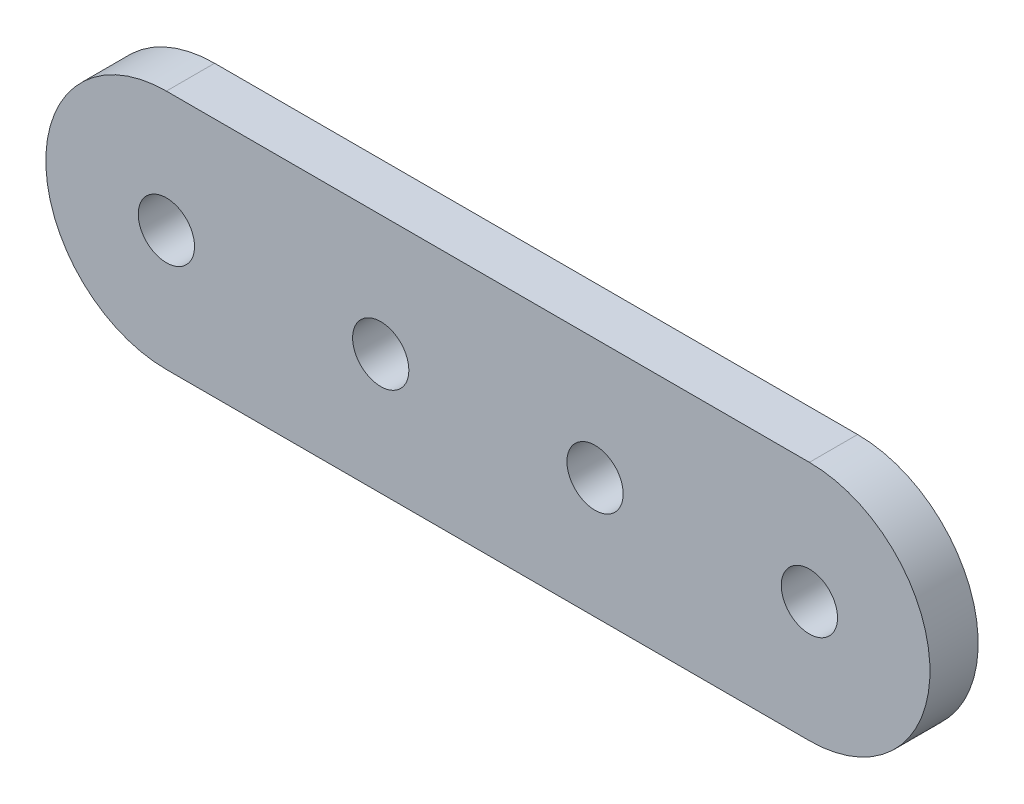
ISO-10303-21;
HEADER;
FILE_DESCRIPTION(('STEP AP214'),'2;1');
FILE_NAME('part.step','',(''),(''),'','','');
FILE_SCHEMA(('AUTOMOTIVE_DESIGN { 1 0 10303 214 1 1 1 1 }'));
ENDSEC;
DATA;
#1=APPLICATION_CONTEXT('core data for automotive mechanical design processes');
#2=APPLICATION_PROTOCOL_DEFINITION('international standard','automotive_design',2000,#1);
#3=PRODUCT_CONTEXT('',#1,'mechanical');
#4=PRODUCT('Part','Part','',(#3));
#5=PRODUCT_RELATED_PRODUCT_CATEGORY('part','',(#4));
#6=PRODUCT_DEFINITION_FORMATION('','',#4);
#7=PRODUCT_DEFINITION_CONTEXT('part definition',#1,'design');
#8=PRODUCT_DEFINITION('design','',#6,#7);
#9=PRODUCT_DEFINITION_SHAPE('','',#8);
#10=(LENGTH_UNIT() NAMED_UNIT(*) SI_UNIT(.MILLI.,.METRE.));
#11=(NAMED_UNIT(*) PLANE_ANGLE_UNIT() SI_UNIT($,.RADIAN.));
#12=(NAMED_UNIT(*) SI_UNIT($,.STERADIAN.) SOLID_ANGLE_UNIT());
#13=UNCERTAINTY_MEASURE_WITH_UNIT(LENGTH_MEASURE(1.E-05),#10,'distance_accuracy_value','');
#14=(GEOMETRIC_REPRESENTATION_CONTEXT(3) GLOBAL_UNCERTAINTY_ASSIGNED_CONTEXT((#13)) GLOBAL_UNIT_ASSIGNED_CONTEXT((#10,
#11,#12)) REPRESENTATION_CONTEXT('',''));
#15=CARTESIAN_POINT('',(0.,0.,0.));
#16=DIRECTION('',(0.,0.,1.));
#17=DIRECTION('',(1.,0.,0.));
#18=AXIS2_PLACEMENT_3D('',#15,#16,#17);
#19=CARTESIAN_POINT('',(20.,0.,3.));
#20=DIRECTION('',(0.,0.,-1.));
#21=DIRECTION('',(-1.,0.,0.));
#22=AXIS2_PLACEMENT_3D('',#19,#20,#21);
#23=PLANE('',#22);
#24=CARTESIAN_POINT('',(-6.66666666666667,0.,3.));
#25=DIRECTION('',(0.,0.,1.));
#26=DIRECTION('',(1.,0.,0.));
#27=AXIS2_PLACEMENT_3D('',#24,#25,#26);
#28=CIRCLE('',#27,1.75);
#29=CARTESIAN_POINT('',(-4.91666666666667,0.,3.));
#30=VERTEX_POINT('',#29);
#31=EDGE_CURVE('E119',#30,#30,#28,.T.);
#32=ORIENTED_EDGE('',*,*,#31,.F.);
#33=EDGE_LOOP('',(#32));
#34=FACE_BOUND('',#33,.T.);
#35=CARTESIAN_POINT('',(-20.,0.,3.));
#36=DIRECTION('',(0.,0.,1.));
#37=DIRECTION('',(1.,0.,0.));
#38=AXIS2_PLACEMENT_3D('',#35,#36,#37);
#39=CIRCLE('',#38,1.75);
#40=CARTESIAN_POINT('',(-18.25,0.,3.));
#41=VERTEX_POINT('',#40);
#42=EDGE_CURVE('E98',#41,#41,#39,.T.);
#43=ORIENTED_EDGE('',*,*,#42,.F.);
#44=EDGE_LOOP('',(#43));
#45=FACE_BOUND('',#44,.T.);
#46=CARTESIAN_POINT('',(20.,0.,3.));
#47=DIRECTION('',(0.,0.,1.));
#48=DIRECTION('',(-1.,0.,0.));
#49=AXIS2_PLACEMENT_3D('',#46,#47,#48);
#50=CIRCLE('',#49,7.5);
#51=CARTESIAN_POINT('',(20.,-7.5,3.));
#52=VERTEX_POINT('',#51);
#53=CARTESIAN_POINT('',(20.,7.5,3.));
#54=VERTEX_POINT('',#53);
#55=EDGE_CURVE('E83',#52,#54,#50,.T.);
#56=ORIENTED_EDGE('',*,*,#55,.T.);
#57=DIRECTION('',(-1.,0.,0.));
#58=VECTOR('',#57,1.);
#59=CARTESIAN_POINT('',(-20.,7.5,3.));
#60=LINE('',#59,#58);
#61=CARTESIAN_POINT('',(-20.,7.5,3.));
#62=VERTEX_POINT('',#61);
#63=EDGE_CURVE('E78',#54,#62,#60,.T.);
#64=ORIENTED_EDGE('',*,*,#63,.T.);
#65=CARTESIAN_POINT('',(-20.,0.,3.));
#66=DIRECTION('',(0.,0.,1.));
#67=DIRECTION('',(1.,0.,0.));
#68=AXIS2_PLACEMENT_3D('',#65,#66,#67);
#69=CIRCLE('',#68,7.5);
#70=CARTESIAN_POINT('',(-20.,-7.5,3.));
#71=VERTEX_POINT('',#70);
#72=EDGE_CURVE('E81',#62,#71,#69,.T.);
#73=ORIENTED_EDGE('',*,*,#72,.T.);
#74=DIRECTION('',(1.,0.,0.));
#75=VECTOR('',#74,1.);
#76=CARTESIAN_POINT('',(-20.,-7.5,3.));
#77=LINE('',#76,#75);
#78=EDGE_CURVE('E48',#71,#52,#77,.T.);
#79=ORIENTED_EDGE('',*,*,#78,.T.);
#80=EDGE_LOOP('',(#56,#64,#73,#79));
#81=FACE_BOUND('',#80,.T.);
#82=CARTESIAN_POINT('',(20.,0.,3.));
#83=DIRECTION('',(0.,0.,1.));
#84=DIRECTION('',(1.,0.,0.));
#85=AXIS2_PLACEMENT_3D('',#82,#83,#84);
#86=CIRCLE('',#85,1.75);
#87=CARTESIAN_POINT('',(21.75,0.,3.));
#88=VERTEX_POINT('',#87);
#89=EDGE_CURVE('E113',#88,#88,#86,.T.);
#90=ORIENTED_EDGE('',*,*,#89,.F.);
#91=EDGE_LOOP('',(#90));
#92=FACE_BOUND('',#91,.T.);
#93=CARTESIAN_POINT('',(6.66666666666667,0.,3.));
#94=DIRECTION('',(0.,0.,1.));
#95=DIRECTION('',(1.,0.,0.));
#96=AXIS2_PLACEMENT_3D('',#93,#94,#95);
#97=CIRCLE('',#96,1.75);
#98=CARTESIAN_POINT('',(8.41666666666667,0.,3.));
#99=VERTEX_POINT('',#98);
#100=EDGE_CURVE('E125',#99,#99,#97,.T.);
#101=ORIENTED_EDGE('',*,*,#100,.F.);
#102=EDGE_LOOP('',(#101));
#103=FACE_BOUND('',#102,.T.);
#104=ADVANCED_FACE('F31',(#34,#45,#81,#92,#103),#23,.F.);
#105=CARTESIAN_POINT('',(20.,0.,0.));
#106=DIRECTION('',(0.,0.,-1.));
#107=DIRECTION('',(-1.,0.,0.));
#108=AXIS2_PLACEMENT_3D('',#105,#106,#107);
#109=PLANE('',#108);
#110=CARTESIAN_POINT('',(-6.66666666666667,0.,0.));
#111=DIRECTION('',(0.,0.,1.));
#112=DIRECTION('',(1.,0.,0.));
#113=AXIS2_PLACEMENT_3D('',#110,#111,#112);
#114=CIRCLE('',#113,1.75);
#115=CARTESIAN_POINT('',(-4.91666666666667,0.,0.));
#116=VERTEX_POINT('',#115);
#117=EDGE_CURVE('E122',#116,#116,#114,.T.);
#118=ORIENTED_EDGE('',*,*,#117,.T.);
#119=EDGE_LOOP('',(#118));
#120=FACE_BOUND('',#119,.T.);
#121=CARTESIAN_POINT('',(-20.,0.,0.));
#122=DIRECTION('',(0.,0.,1.));
#123=DIRECTION('',(1.,0.,0.));
#124=AXIS2_PLACEMENT_3D('',#121,#122,#123);
#125=CIRCLE('',#124,1.75);
#126=CARTESIAN_POINT('',(-18.25,0.,0.));
#127=VERTEX_POINT('',#126);
#128=EDGE_CURVE('E110',#127,#127,#125,.T.);
#129=ORIENTED_EDGE('',*,*,#128,.T.);
#130=EDGE_LOOP('',(#129));
#131=FACE_BOUND('',#130,.T.);
#132=CARTESIAN_POINT('',(20.,0.,0.));
#133=DIRECTION('',(0.,0.,1.));
#134=DIRECTION('',(-1.,0.,0.));
#135=AXIS2_PLACEMENT_3D('',#132,#133,#134);
#136=CIRCLE('',#135,7.5);
#137=CARTESIAN_POINT('',(20.,-7.5,0.));
#138=VERTEX_POINT('',#137);
#139=CARTESIAN_POINT('',(20.,7.5,0.));
#140=VERTEX_POINT('',#139);
#141=EDGE_CURVE('E95',#138,#140,#136,.T.);
#142=ORIENTED_EDGE('',*,*,#141,.F.);
#143=DIRECTION('',(1.,0.,0.));
#144=VECTOR('',#143,1.);
#145=CARTESIAN_POINT('',(-20.,-7.5,0.));
#146=LINE('',#145,#144);
#147=CARTESIAN_POINT('',(-20.,-7.5,0.));
#148=VERTEX_POINT('',#147);
#149=EDGE_CURVE('E71',#148,#138,#146,.T.);
#150=ORIENTED_EDGE('',*,*,#149,.F.);
#151=CARTESIAN_POINT('',(-20.,0.,0.));
#152=DIRECTION('',(0.,0.,1.));
#153=DIRECTION('',(1.,0.,0.));
#154=AXIS2_PLACEMENT_3D('',#151,#152,#153);
#155=CIRCLE('',#154,7.5);
#156=CARTESIAN_POINT('',(-20.,7.5,0.));
#157=VERTEX_POINT('',#156);
#158=EDGE_CURVE('E65',#157,#148,#155,.T.);
#159=ORIENTED_EDGE('',*,*,#158,.F.);
#160=DIRECTION('',(-1.,0.,0.));
#161=VECTOR('',#160,1.);
#162=CARTESIAN_POINT('',(-20.,7.5,0.));
#163=LINE('',#162,#161);
#164=EDGE_CURVE('E87',#140,#157,#163,.T.);
#165=ORIENTED_EDGE('',*,*,#164,.F.);
#166=EDGE_LOOP('',(#142,#150,#159,#165));
#167=FACE_BOUND('',#166,.T.);
#168=CARTESIAN_POINT('',(20.,0.,0.));
#169=DIRECTION('',(0.,0.,1.));
#170=DIRECTION('',(1.,0.,0.));
#171=AXIS2_PLACEMENT_3D('',#168,#169,#170);
#172=CIRCLE('',#171,1.75);
#173=CARTESIAN_POINT('',(21.75,0.,0.));
#174=VERTEX_POINT('',#173);
#175=EDGE_CURVE('E116',#174,#174,#172,.T.);
#176=ORIENTED_EDGE('',*,*,#175,.T.);
#177=EDGE_LOOP('',(#176));
#178=FACE_BOUND('',#177,.T.);
#179=CARTESIAN_POINT('',(6.66666666666667,0.,0.));
#180=DIRECTION('',(0.,0.,1.));
#181=DIRECTION('',(1.,0.,0.));
#182=AXIS2_PLACEMENT_3D('',#179,#180,#181);
#183=CIRCLE('',#182,1.75);
#184=CARTESIAN_POINT('',(8.41666666666667,0.,0.));
#185=VERTEX_POINT('',#184);
#186=EDGE_CURVE('E128',#185,#185,#183,.T.);
#187=ORIENTED_EDGE('',*,*,#186,.T.);
#188=EDGE_LOOP('',(#187));
#189=FACE_BOUND('',#188,.T.);
#190=ADVANCED_FACE('F106',(#120,#131,#167,#178,#189),#109,.T.);
#191=CARTESIAN_POINT('',(20.,0.,3.));
#192=DIRECTION('',(0.,0.,-1.));
#193=DIRECTION('',(-1.,0.,0.));
#194=AXIS2_PLACEMENT_3D('',#191,#192,#193);
#195=CYLINDRICAL_SURFACE('',#194,7.5);
#196=ORIENTED_EDGE('',*,*,#141,.T.);
#197=DIRECTION('',(0.,0.,-1.));
#198=VECTOR('',#197,1.);
#199=CARTESIAN_POINT('',(20.,7.5,3.));
#200=LINE('',#199,#198);
#201=EDGE_CURVE('E11',#54,#140,#200,.T.);
#202=ORIENTED_EDGE('',*,*,#201,.F.);
#203=ORIENTED_EDGE('',*,*,#55,.F.);
#204=DIRECTION('',(0.,0.,-1.));
#205=VECTOR('',#204,1.);
#206=CARTESIAN_POINT('',(20.,-7.5,3.));
#207=LINE('',#206,#205);
#208=EDGE_CURVE('E91',#52,#138,#207,.T.);
#209=ORIENTED_EDGE('',*,*,#208,.T.);
#210=EDGE_LOOP('',(#196,#202,#203,#209));
#211=FACE_BOUND('',#210,.T.);
#212=ADVANCED_FACE('F33',(#211),#195,.T.);
#213=CARTESIAN_POINT('',(-20.,7.5,3.));
#214=DIRECTION('',(0.,-1.,0.));
#215=DIRECTION('',(0.,0.,-1.));
#216=AXIS2_PLACEMENT_3D('',#213,#214,#215);
#217=PLANE('',#216);
#218=ORIENTED_EDGE('',*,*,#164,.T.);
#219=DIRECTION('',(0.,0.,-1.));
#220=VECTOR('',#219,1.);
#221=CARTESIAN_POINT('',(-20.,7.5,3.));
#222=LINE('',#221,#220);
#223=EDGE_CURVE('E40',#62,#157,#222,.T.);
#224=ORIENTED_EDGE('',*,*,#223,.F.);
#225=ORIENTED_EDGE('',*,*,#63,.F.);
#226=ORIENTED_EDGE('',*,*,#201,.T.);
#227=EDGE_LOOP('',(#218,#224,#225,#226));
#228=FACE_BOUND('',#227,.T.);
#229=ADVANCED_FACE('F86',(#228),#217,.F.);
#230=CARTESIAN_POINT('',(-20.,0.,3.));
#231=DIRECTION('',(0.,0.,-1.));
#232=DIRECTION('',(-1.,0.,0.));
#233=AXIS2_PLACEMENT_3D('',#230,#231,#232);
#234=CYLINDRICAL_SURFACE('',#233,7.5);
#235=ORIENTED_EDGE('',*,*,#158,.T.);
#236=DIRECTION('',(0.,0.,-1.));
#237=VECTOR('',#236,1.);
#238=CARTESIAN_POINT('',(-20.,-7.5,3.));
#239=LINE('',#238,#237);
#240=EDGE_CURVE('E88',#71,#148,#239,.T.);
#241=ORIENTED_EDGE('',*,*,#240,.F.);
#242=ORIENTED_EDGE('',*,*,#72,.F.);
#243=ORIENTED_EDGE('',*,*,#223,.T.);
#244=EDGE_LOOP('',(#235,#241,#242,#243));
#245=FACE_BOUND('',#244,.T.);
#246=ADVANCED_FACE('F89',(#245),#234,.T.);
#247=CARTESIAN_POINT('',(-20.,-7.5,3.));
#248=DIRECTION('',(0.,1.,0.));
#249=DIRECTION('',(-1.,0.,0.));
#250=AXIS2_PLACEMENT_3D('',#247,#248,#249);
#251=PLANE('',#250);
#252=ORIENTED_EDGE('',*,*,#149,.T.);
#253=ORIENTED_EDGE('',*,*,#208,.F.);
#254=ORIENTED_EDGE('',*,*,#78,.F.);
#255=ORIENTED_EDGE('',*,*,#240,.T.);
#256=EDGE_LOOP('',(#252,#253,#254,#255));
#257=FACE_BOUND('',#256,.T.);
#258=ADVANCED_FACE('F103',(#257),#251,.F.);
#259=CARTESIAN_POINT('',(-20.,0.,3.));
#260=DIRECTION('',(0.,0.,-1.));
#261=DIRECTION('',(-1.,0.,0.));
#262=AXIS2_PLACEMENT_3D('',#259,#260,#261);
#263=CYLINDRICAL_SURFACE('',#262,1.75);
#264=ORIENTED_EDGE('',*,*,#42,.T.);
#265=EDGE_LOOP('',(#264));
#266=FACE_BOUND('',#265,.T.);
#267=ORIENTED_EDGE('',*,*,#128,.F.);
#268=EDGE_LOOP('',(#267));
#269=FACE_BOUND('',#268,.T.);
#270=ADVANCED_FACE('F148',(#266,#269),#263,.F.);
#271=CARTESIAN_POINT('',(20.,0.,3.));
#272=DIRECTION('',(0.,0.,-1.));
#273=DIRECTION('',(-1.,0.,0.));
#274=AXIS2_PLACEMENT_3D('',#271,#272,#273);
#275=CYLINDRICAL_SURFACE('',#274,1.75);
#276=ORIENTED_EDGE('',*,*,#89,.T.);
#277=EDGE_LOOP('',(#276));
#278=FACE_BOUND('',#277,.T.);
#279=ORIENTED_EDGE('',*,*,#175,.F.);
#280=EDGE_LOOP('',(#279));
#281=FACE_BOUND('',#280,.T.);
#282=ADVANCED_FACE('F194',(#278,#281),#275,.F.);
#283=CARTESIAN_POINT('',(-6.66666666666667,0.,3.));
#284=DIRECTION('',(0.,0.,-1.));
#285=DIRECTION('',(-1.,0.,0.));
#286=AXIS2_PLACEMENT_3D('',#283,#284,#285);
#287=CYLINDRICAL_SURFACE('',#286,1.75);
#288=ORIENTED_EDGE('',*,*,#31,.T.);
#289=EDGE_LOOP('',(#288));
#290=FACE_BOUND('',#289,.T.);
#291=ORIENTED_EDGE('',*,*,#117,.F.);
#292=EDGE_LOOP('',(#291));
#293=FACE_BOUND('',#292,.T.);
#294=ADVANCED_FACE('F202',(#290,#293),#287,.F.);
#295=CARTESIAN_POINT('',(6.66666666666667,0.,3.));
#296=DIRECTION('',(0.,0.,-1.));
#297=DIRECTION('',(-1.,0.,0.));
#298=AXIS2_PLACEMENT_3D('',#295,#296,#297);
#299=CYLINDRICAL_SURFACE('',#298,1.75);
#300=ORIENTED_EDGE('',*,*,#100,.T.);
#301=EDGE_LOOP('',(#300));
#302=FACE_BOUND('',#301,.T.);
#303=ORIENTED_EDGE('',*,*,#186,.F.);
#304=EDGE_LOOP('',(#303));
#305=FACE_BOUND('',#304,.T.);
#306=ADVANCED_FACE('F134',(#302,#305),#299,.F.);
#307=CLOSED_SHELL('',(#104,#190,#212,#229,#246,#258,#270,#282,#294,#306));
#308=MANIFOLD_SOLID_BREP('B2',#307);
#309=ADVANCED_BREP_SHAPE_REPRESENTATION('',(#18,#308),#14);
#310=SHAPE_DEFINITION_REPRESENTATION(#9,#309);
ENDSEC;
END-ISO-10303-21;
